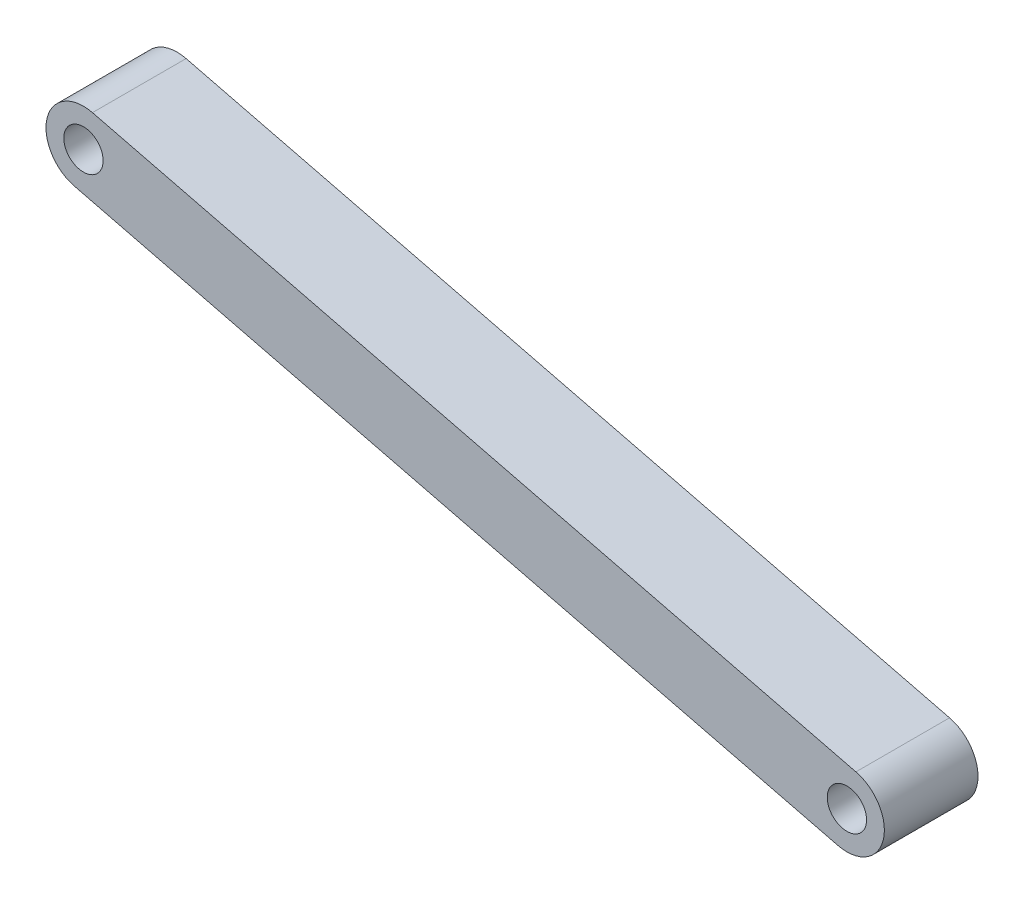
ISO-10303-21;
HEADER;
FILE_DESCRIPTION(('STEP AP214'),'2;1');
FILE_NAME('part.step','',(''),(''),'','','');
FILE_SCHEMA(('AUTOMOTIVE_DESIGN { 1 0 10303 214 1 1 1 1 }'));
ENDSEC;
DATA;
#1=APPLICATION_CONTEXT('core data for automotive mechanical design processes');
#2=APPLICATION_PROTOCOL_DEFINITION('international standard','automotive_design',2000,#1);
#3=PRODUCT_CONTEXT('',#1,'mechanical');
#4=PRODUCT('Part','Part','',(#3));
#5=PRODUCT_RELATED_PRODUCT_CATEGORY('part','',(#4));
#6=PRODUCT_DEFINITION_FORMATION('','',#4);
#7=PRODUCT_DEFINITION_CONTEXT('part definition',#1,'design');
#8=PRODUCT_DEFINITION('design','',#6,#7);
#9=PRODUCT_DEFINITION_SHAPE('','',#8);
#10=(LENGTH_UNIT() NAMED_UNIT(*) SI_UNIT(.MILLI.,.METRE.));
#11=(NAMED_UNIT(*) PLANE_ANGLE_UNIT() SI_UNIT($,.RADIAN.));
#12=(NAMED_UNIT(*) SI_UNIT($,.STERADIAN.) SOLID_ANGLE_UNIT());
#13=UNCERTAINTY_MEASURE_WITH_UNIT(LENGTH_MEASURE(1.E-05),#10,'distance_accuracy_value','');
#14=(GEOMETRIC_REPRESENTATION_CONTEXT(3) GLOBAL_UNCERTAINTY_ASSIGNED_CONTEXT((#13)) GLOBAL_UNIT_ASSIGNED_CONTEXT((#10,
#11,#12)) REPRESENTATION_CONTEXT('',''));
#15=CARTESIAN_POINT('',(0.,0.,0.));
#16=DIRECTION('',(0.,0.,1.));
#17=DIRECTION('',(1.,0.,0.));
#18=AXIS2_PLACEMENT_3D('',#15,#16,#17);
#19=CARTESIAN_POINT('',(19.,-4.,11.));
#20=DIRECTION('',(0.,0.,-1.));
#21=DIRECTION('',(-1.,0.,0.));
#22=AXIS2_PLACEMENT_3D('',#19,#20,#21);
#23=CYLINDRICAL_SURFACE('',#22,2.00000000000001);
#24=CARTESIAN_POINT('',(19.,-4.,6.));
#25=DIRECTION('',(0.,0.,1.));
#26=DIRECTION('',(1.,0.,0.));
#27=AXIS2_PLACEMENT_3D('',#24,#25,#26);
#28=CIRCLE('',#27,2.00000000000001);
#29=CARTESIAN_POINT('',(19.4811026571338,-2.05872716155125,6.));
#30=VERTEX_POINT('',#29);
#31=CARTESIAN_POINT('',(18.5188973428662,-5.94127283844874,6.));
#32=VERTEX_POINT('',#31);
#33=EDGE_CURVE('E102',#30,#32,#28,.T.);
#34=ORIENTED_EDGE('',*,*,#33,.T.);
#35=DIRECTION('',(0.,0.,-1.));
#36=VECTOR('',#35,1.);
#37=CARTESIAN_POINT('',(18.5188973428662,-5.94127283844874,11.));
#38=LINE('',#37,#36);
#39=CARTESIAN_POINT('',(18.5188973428662,-5.94127283844874,11.));
#40=VERTEX_POINT('',#39);
#41=EDGE_CURVE('E11',#40,#32,#38,.T.);
#42=ORIENTED_EDGE('',*,*,#41,.F.);
#43=CARTESIAN_POINT('',(19.,-4.,11.));
#44=DIRECTION('',(0.,0.,1.));
#45=DIRECTION('',(1.,0.,0.));
#46=AXIS2_PLACEMENT_3D('',#43,#44,#45);
#47=CIRCLE('',#46,2.00000000000001);
#48=CARTESIAN_POINT('',(19.4811026571338,-2.05872716155125,11.));
#49=VERTEX_POINT('',#48);
#50=EDGE_CURVE('E89',#49,#40,#47,.T.);
#51=ORIENTED_EDGE('',*,*,#50,.F.);
#52=DIRECTION('',(0.,0.,-1.));
#53=VECTOR('',#52,1.);
#54=CARTESIAN_POINT('',(19.4811026571338,-2.05872716155125,11.));
#55=LINE('',#54,#53);
#56=EDGE_CURVE('E98',#49,#30,#55,.T.);
#57=ORIENTED_EDGE('',*,*,#56,.T.);
#58=EDGE_LOOP('',(#34,#42,#51,#57));
#59=FACE_BOUND('',#58,.T.);
#60=ADVANCED_FACE('F36',(#59),#23,.T.);
#61=CARTESIAN_POINT('',(18.5188973428662,-5.94127283844874,11.));
#62=DIRECTION('',(0.240551328566886,0.97063641922437,0.));
#63=DIRECTION('',(-0.97063641922437,0.240551328566886,0.));
#64=AXIS2_PLACEMENT_3D('',#61,#62,#63);
#65=PLANE('',#64);
#66=DIRECTION('',(0.970636419224369,-0.240551328566886,0.));
#67=VECTOR('',#66,1.);
#68=CARTESIAN_POINT('',(18.5188973428662,-5.94127283844874,6.));
#69=LINE('',#68,#67);
#70=CARTESIAN_POINT('',(59.2856269502898,-16.0444286382579,6.));
#71=VERTEX_POINT('',#70);
#72=EDGE_CURVE('E93',#32,#71,#69,.T.);
#73=ORIENTED_EDGE('',*,*,#72,.T.);
#74=DIRECTION('',(0.,0.,-1.));
#75=VECTOR('',#74,1.);
#76=CARTESIAN_POINT('',(59.2856269502898,-16.0444286382579,11.));
#77=LINE('',#76,#75);
#78=CARTESIAN_POINT('',(59.2856269502898,-16.0444286382579,11.));
#79=VERTEX_POINT('',#78);
#80=EDGE_CURVE('E45',#79,#71,#77,.T.);
#81=ORIENTED_EDGE('',*,*,#80,.F.);
#82=DIRECTION('',(0.970636419224369,-0.240551328566886,0.));
#83=VECTOR('',#82,1.);
#84=CARTESIAN_POINT('',(18.5188973428662,-5.94127283844874,11.));
#85=LINE('',#84,#83);
#86=EDGE_CURVE('E84',#40,#79,#85,.T.);
#87=ORIENTED_EDGE('',*,*,#86,.F.);
#88=ORIENTED_EDGE('',*,*,#41,.T.);
#89=EDGE_LOOP('',(#73,#81,#87,#88));
#90=FACE_BOUND('',#89,.T.);
#91=ADVANCED_FACE('F92',(#90),#65,.F.);
#92=CARTESIAN_POINT('',(59.7667296074235,-14.1031557998092,11.));
#93=DIRECTION('',(0.,0.,-1.));
#94=DIRECTION('',(-1.,0.,0.));
#95=AXIS2_PLACEMENT_3D('',#92,#93,#94);
#96=CYLINDRICAL_SURFACE('',#95,2.00000000000001);
#97=CARTESIAN_POINT('',(59.7667296074235,-14.1031557998092,6.));
#98=DIRECTION('',(0.,0.,1.));
#99=DIRECTION('',(1.,0.,0.));
#100=AXIS2_PLACEMENT_3D('',#97,#98,#99);
#101=CIRCLE('',#100,2.00000000000001);
#102=CARTESIAN_POINT('',(60.2478322645573,-12.1618829613605,6.));
#103=VERTEX_POINT('',#102);
#104=EDGE_CURVE('E71',#71,#103,#101,.T.);
#105=ORIENTED_EDGE('',*,*,#104,.T.);
#106=DIRECTION('',(0.,0.,-1.));
#107=VECTOR('',#106,1.);
#108=CARTESIAN_POINT('',(60.2478322645573,-12.1618829613605,11.));
#109=LINE('',#108,#107);
#110=CARTESIAN_POINT('',(60.2478322645573,-12.1618829613605,11.));
#111=VERTEX_POINT('',#110);
#112=EDGE_CURVE('E94',#111,#103,#109,.T.);
#113=ORIENTED_EDGE('',*,*,#112,.F.);
#114=CARTESIAN_POINT('',(59.7667296074235,-14.1031557998092,11.));
#115=DIRECTION('',(0.,0.,1.));
#116=DIRECTION('',(1.,0.,0.));
#117=AXIS2_PLACEMENT_3D('',#114,#115,#116);
#118=CIRCLE('',#117,2.00000000000001);
#119=EDGE_CURVE('E87',#79,#111,#118,.T.);
#120=ORIENTED_EDGE('',*,*,#119,.F.);
#121=ORIENTED_EDGE('',*,*,#80,.T.);
#122=EDGE_LOOP('',(#105,#113,#120,#121));
#123=FACE_BOUND('',#122,.T.);
#124=ADVANCED_FACE('F96',(#123),#96,.T.);
#125=CARTESIAN_POINT('',(19.4811026571338,-2.05872716155125,11.));
#126=DIRECTION('',(-0.240551328566886,-0.97063641922437,0.));
#127=DIRECTION('',(0.97063641922437,-0.240551328566886,0.));
#128=AXIS2_PLACEMENT_3D('',#125,#126,#127);
#129=PLANE('',#128);
#130=DIRECTION('',(-0.970636419224369,0.240551328566886,0.));
#131=VECTOR('',#130,1.);
#132=CARTESIAN_POINT('',(19.4811026571338,-2.05872716155125,6.));
#133=LINE('',#132,#131);
#134=EDGE_CURVE('E77',#103,#30,#133,.T.);
#135=ORIENTED_EDGE('',*,*,#134,.T.);
#136=ORIENTED_EDGE('',*,*,#56,.F.);
#137=DIRECTION('',(-0.970636419224369,0.240551328566886,0.));
#138=VECTOR('',#137,1.);
#139=CARTESIAN_POINT('',(19.4811026571338,-2.05872716155125,11.));
#140=LINE('',#139,#138);
#141=EDGE_CURVE('E54',#111,#49,#140,.T.);
#142=ORIENTED_EDGE('',*,*,#141,.F.);
#143=ORIENTED_EDGE('',*,*,#112,.T.);
#144=EDGE_LOOP('',(#135,#136,#142,#143));
#145=FACE_BOUND('',#144,.T.);
#146=ADVANCED_FACE('F129',(#145),#129,.F.);
#147=CARTESIAN_POINT('',(19.,-4.,11.));
#148=DIRECTION('',(0.,0.,1.));
#149=DIRECTION('',(1.,0.,0.));
#150=AXIS2_PLACEMENT_3D('',#147,#148,#149);
#151=PLANE('',#150);
#152=CARTESIAN_POINT('',(19.,-4.,11.));
#153=DIRECTION('',(0.,0.,1.));
#154=DIRECTION('',(1.,0.,0.));
#155=AXIS2_PLACEMENT_3D('',#152,#153,#154);
#156=CIRCLE('',#155,1.05);
#157=CARTESIAN_POINT('',(20.05,-4.,11.));
#158=VERTEX_POINT('',#157);
#159=EDGE_CURVE('E111',#158,#158,#156,.T.);
#160=ORIENTED_EDGE('',*,*,#159,.F.);
#161=EDGE_LOOP('',(#160));
#162=FACE_BOUND('',#161,.T.);
#163=CARTESIAN_POINT('',(59.7667296074235,-14.1031557998092,11.));
#164=DIRECTION('',(0.,0.,1.));
#165=DIRECTION('',(1.,0.,0.));
#166=AXIS2_PLACEMENT_3D('',#163,#164,#165);
#167=CIRCLE('',#166,1.05);
#168=CARTESIAN_POINT('',(60.8167296074235,-14.1031557998092,11.));
#169=VERTEX_POINT('',#168);
#170=EDGE_CURVE('E116',#169,#169,#167,.T.);
#171=ORIENTED_EDGE('',*,*,#170,.F.);
#172=EDGE_LOOP('',(#171));
#173=FACE_BOUND('',#172,.T.);
#174=ORIENTED_EDGE('',*,*,#50,.T.);
#175=ORIENTED_EDGE('',*,*,#86,.T.);
#176=ORIENTED_EDGE('',*,*,#119,.T.);
#177=ORIENTED_EDGE('',*,*,#141,.T.);
#178=EDGE_LOOP('',(#174,#175,#176,#177));
#179=FACE_BOUND('',#178,.T.);
#180=ADVANCED_FACE('F85',(#162,#173,#179),#151,.T.);
#181=CARTESIAN_POINT('',(19.,-4.,6.));
#182=DIRECTION('',(0.,0.,1.));
#183=DIRECTION('',(1.,0.,0.));
#184=AXIS2_PLACEMENT_3D('',#181,#182,#183);
#185=PLANE('',#184);
#186=CARTESIAN_POINT('',(19.,-4.,6.));
#187=DIRECTION('',(0.,0.,1.));
#188=DIRECTION('',(1.,0.,0.));
#189=AXIS2_PLACEMENT_3D('',#186,#187,#188);
#190=CIRCLE('',#189,1.05);
#191=CARTESIAN_POINT('',(20.05,-4.,6.));
#192=VERTEX_POINT('',#191);
#193=EDGE_CURVE('E39',#192,#192,#190,.T.);
#194=ORIENTED_EDGE('',*,*,#193,.T.);
#195=EDGE_LOOP('',(#194));
#196=FACE_BOUND('',#195,.T.);
#197=CARTESIAN_POINT('',(59.7667296074235,-14.1031557998092,6.));
#198=DIRECTION('',(0.,0.,1.));
#199=DIRECTION('',(1.,0.,0.));
#200=AXIS2_PLACEMENT_3D('',#197,#198,#199);
#201=CIRCLE('',#200,1.05);
#202=CARTESIAN_POINT('',(60.8167296074235,-14.1031557998092,6.));
#203=VERTEX_POINT('',#202);
#204=EDGE_CURVE('E109',#203,#203,#201,.T.);
#205=ORIENTED_EDGE('',*,*,#204,.T.);
#206=EDGE_LOOP('',(#205));
#207=FACE_BOUND('',#206,.T.);
#208=ORIENTED_EDGE('',*,*,#33,.F.);
#209=ORIENTED_EDGE('',*,*,#134,.F.);
#210=ORIENTED_EDGE('',*,*,#104,.F.);
#211=ORIENTED_EDGE('',*,*,#72,.F.);
#212=EDGE_LOOP('',(#208,#209,#210,#211));
#213=FACE_BOUND('',#212,.T.);
#214=ADVANCED_FACE('F128',(#196,#207,#213),#185,.F.);
#215=CARTESIAN_POINT('',(59.7667296074235,-14.1031557998092,-11.));
#216=DIRECTION('',(0.,0.,1.));
#217=DIRECTION('',(1.,0.,0.));
#218=AXIS2_PLACEMENT_3D('',#215,#216,#217);
#219=CYLINDRICAL_SURFACE('',#218,1.05);
#220=ORIENTED_EDGE('',*,*,#170,.T.);
#221=EDGE_LOOP('',(#220));
#222=FACE_BOUND('',#221,.T.);
#223=ORIENTED_EDGE('',*,*,#204,.F.);
#224=EDGE_LOOP('',(#223));
#225=FACE_BOUND('',#224,.T.);
#226=ADVANCED_FACE('F124',(#222,#225),#219,.F.);
#227=CARTESIAN_POINT('',(19.,-4.,-11.));
#228=DIRECTION('',(0.,0.,1.));
#229=DIRECTION('',(1.,0.,0.));
#230=AXIS2_PLACEMENT_3D('',#227,#228,#229);
#231=CYLINDRICAL_SURFACE('',#230,1.05);
#232=ORIENTED_EDGE('',*,*,#159,.T.);
#233=EDGE_LOOP('',(#232));
#234=FACE_BOUND('',#233,.T.);
#235=ORIENTED_EDGE('',*,*,#193,.F.);
#236=EDGE_LOOP('',(#235));
#237=FACE_BOUND('',#236,.T.);
#238=ADVANCED_FACE('F179',(#234,#237),#231,.F.);
#239=CLOSED_SHELL('',(#60,#91,#124,#146,#180,#214,#226,#238));
#240=MANIFOLD_SOLID_BREP('B2',#239);
#241=ADVANCED_BREP_SHAPE_REPRESENTATION('',(#18,#240),#14);
#242=SHAPE_DEFINITION_REPRESENTATION(#9,#241);
ENDSEC;
END-ISO-10303-21;
